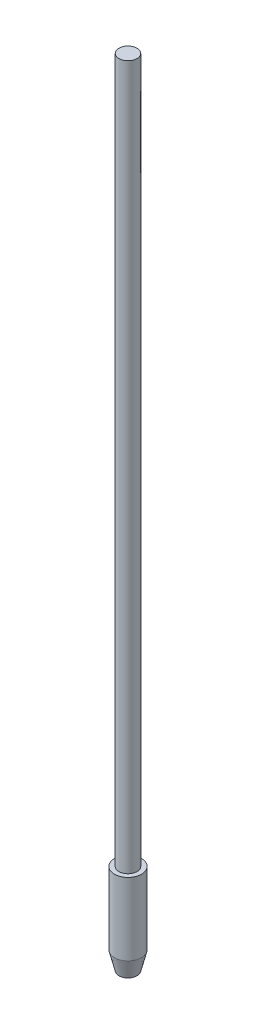
ISO-10303-21;
HEADER;
FILE_DESCRIPTION(('STEP AP214'),'2;1');
FILE_NAME('part.step','',(''),(''),'','','');
FILE_SCHEMA(('AUTOMOTIVE_DESIGN { 1 0 10303 214 1 1 1 1 }'));
ENDSEC;
DATA;
#1=APPLICATION_CONTEXT('core data for automotive mechanical design processes');
#2=APPLICATION_PROTOCOL_DEFINITION('international standard','automotive_design',2000,#1);
#3=PRODUCT_CONTEXT('',#1,'mechanical');
#4=PRODUCT('Part','Part','',(#3));
#5=PRODUCT_RELATED_PRODUCT_CATEGORY('part','',(#4));
#6=PRODUCT_DEFINITION_FORMATION('','',#4);
#7=PRODUCT_DEFINITION_CONTEXT('part definition',#1,'design');
#8=PRODUCT_DEFINITION('design','',#6,#7);
#9=PRODUCT_DEFINITION_SHAPE('','',#8);
#10=(LENGTH_UNIT() NAMED_UNIT(*) SI_UNIT(.MILLI.,.METRE.));
#11=(NAMED_UNIT(*) PLANE_ANGLE_UNIT() SI_UNIT($,.RADIAN.));
#12=(NAMED_UNIT(*) SI_UNIT($,.STERADIAN.) SOLID_ANGLE_UNIT());
#13=UNCERTAINTY_MEASURE_WITH_UNIT(LENGTH_MEASURE(1.E-05),#10,'distance_accuracy_value','');
#14=(GEOMETRIC_REPRESENTATION_CONTEXT(3) GLOBAL_UNCERTAINTY_ASSIGNED_CONTEXT((#13)) GLOBAL_UNIT_ASSIGNED_CONTEXT((#10,
#11,#12)) REPRESENTATION_CONTEXT('',''));
#15=CARTESIAN_POINT('',(0.,0.,0.));
#16=DIRECTION('',(0.,0.,1.));
#17=DIRECTION('',(1.,0.,0.));
#18=AXIS2_PLACEMENT_3D('',#15,#16,#17);
#19=CARTESIAN_POINT('',(276.355570330909,-390.,-125.849309683741));
#20=DIRECTION('',(0.,1.,0.));
#21=DIRECTION('',(0.,0.,1.));
#22=AXIS2_PLACEMENT_3D('',#19,#20,#21);
#23=CYLINDRICAL_SURFACE('',#22,4.99999999999999);
#24=CARTESIAN_POINT('',(276.355570330909,-390.,-125.849309683741));
#25=DIRECTION('',(0.,1.,0.));
#26=DIRECTION('',(0.,0.,1.));
#27=AXIS2_PLACEMENT_3D('',#24,#25,#26);
#28=CIRCLE('',#27,4.99999999999999);
#29=CARTESIAN_POINT('',(276.355570330909,-390.,-120.849309683741));
#30=VERTEX_POINT('',#29);
#31=EDGE_CURVE('E53',#30,#30,#28,.T.);
#32=ORIENTED_EDGE('',*,*,#31,.T.);
#33=EDGE_LOOP('',(#32));
#34=FACE_BOUND('',#33,.T.);
#35=CARTESIAN_POINT('',(276.355570330909,0.,-125.849309683741));
#36=DIRECTION('',(0.,1.,0.));
#37=DIRECTION('',(0.,0.,1.));
#38=AXIS2_PLACEMENT_3D('',#35,#36,#37);
#39=CIRCLE('',#38,4.99999999999999);
#40=CARTESIAN_POINT('',(276.355570330909,0.,-120.849309683741));
#41=VERTEX_POINT('',#40);
#42=EDGE_CURVE('E11',#41,#41,#39,.T.);
#43=ORIENTED_EDGE('',*,*,#42,.F.);
#44=EDGE_LOOP('',(#43));
#45=FACE_BOUND('',#44,.T.);
#46=ADVANCED_FACE('F45',(#34,#45),#23,.T.);
#47=CARTESIAN_POINT('',(276.355570330909,0.,-125.849309683741));
#48=DIRECTION('',(0.,1.,0.));
#49=DIRECTION('',(0.,0.,1.));
#50=AXIS2_PLACEMENT_3D('',#47,#48,#49);
#51=PLANE('',#50);
#52=ORIENTED_EDGE('',*,*,#42,.T.);
#53=EDGE_LOOP('',(#52));
#54=FACE_BOUND('',#53,.T.);
#55=ADVANCED_FACE('F102',(#54),#51,.T.);
#56=CARTESIAN_POINT('',(276.355570330909,-430.,-125.849309683741));
#57=DIRECTION('',(0.,1.,0.));
#58=DIRECTION('',(0.,0.,1.));
#59=AXIS2_PLACEMENT_3D('',#56,#57,#58);
#60=CYLINDRICAL_SURFACE('',#59,7.50000000000001);
#61=CARTESIAN_POINT('',(276.355570330909,-430.,-125.849309683741));
#62=DIRECTION('',(0.,1.,0.));
#63=DIRECTION('',(0.,0.,1.));
#64=AXIS2_PLACEMENT_3D('',#61,#62,#63);
#65=CIRCLE('',#64,7.50000000000001);
#66=CARTESIAN_POINT('',(276.355570330909,-430.,-118.349309683741));
#67=VERTEX_POINT('',#66);
#68=EDGE_CURVE('E59',#67,#67,#65,.F.);
#69=ORIENTED_EDGE('',*,*,#68,.F.);
#70=EDGE_LOOP('',(#69));
#71=FACE_BOUND('',#70,.T.);
#72=CARTESIAN_POINT('',(276.355570330909,-390.,-125.849309683741));
#73=DIRECTION('',(0.,-1.,0.));
#74=DIRECTION('',(0.,0.,-1.));
#75=AXIS2_PLACEMENT_3D('',#72,#73,#74);
#76=CIRCLE('',#75,7.50000000000001);
#77=CARTESIAN_POINT('',(276.355570330909,-390.,-133.349309683741));
#78=VERTEX_POINT('',#77);
#79=EDGE_CURVE('E64',#78,#78,#76,.T.);
#80=ORIENTED_EDGE('',*,*,#79,.T.);
#81=EDGE_LOOP('',(#80));
#82=FACE_BOUND('',#81,.T.);
#83=ADVANCED_FACE('F99',(#71,#82),#60,.T.);
#84=CARTESIAN_POINT('',(276.355570330909,-390.,-125.849309683741));
#85=DIRECTION('',(0.,-1.,0.));
#86=DIRECTION('',(0.,0.,-1.));
#87=AXIS2_PLACEMENT_3D('',#84,#85,#86);
#88=PLANE('',#87);
#89=ORIENTED_EDGE('',*,*,#31,.F.);
#90=EDGE_LOOP('',(#89));
#91=FACE_BOUND('',#90,.T.);
#92=ORIENTED_EDGE('',*,*,#79,.F.);
#93=EDGE_LOOP('',(#92));
#94=FACE_BOUND('',#93,.T.);
#95=ADVANCED_FACE('F94',(#91,#94),#88,.F.);
#96=CARTESIAN_POINT('',(276.355570330909,-440.,-125.849309683741));
#97=DIRECTION('',(0.,-1.,0.));
#98=DIRECTION('',(0.,0.,-1.));
#99=AXIS2_PLACEMENT_3D('',#96,#97,#98);
#100=PLANE('',#99);
#101=CARTESIAN_POINT('',(276.355570330909,-440.,-125.849309683741));
#102=DIRECTION('',(0.,-1.,0.));
#103=DIRECTION('',(0.,0.,-1.));
#104=AXIS2_PLACEMENT_3D('',#101,#102,#103);
#105=CIRCLE('',#104,5.);
#106=CARTESIAN_POINT('',(276.355570330909,-440.,-130.849309683741));
#107=VERTEX_POINT('',#106);
#108=EDGE_CURVE('E69',#107,#107,#105,.T.);
#109=ORIENTED_EDGE('',*,*,#108,.T.);
#110=EDGE_LOOP('',(#109));
#111=FACE_BOUND('',#110,.T.);
#112=ADVANCED_FACE('F83',(#111),#100,.T.);
#113=CARTESIAN_POINT('',(276.355570330909,-440.,-125.849309683741));
#114=DIRECTION('',(0.,1.,0.));
#115=DIRECTION('',(0.,0.,1.));
#116=AXIS2_PLACEMENT_3D('',#113,#114,#115);
#117=CONICAL_SURFACE('',#116,5.,0.244978663126865);
#118=ORIENTED_EDGE('',*,*,#68,.T.);
#119=EDGE_LOOP('',(#118));
#120=FACE_BOUND('',#119,.T.);
#121=ORIENTED_EDGE('',*,*,#108,.F.);
#122=EDGE_LOOP('',(#121));
#123=FACE_BOUND('',#122,.T.);
#124=ADVANCED_FACE('F93',(#120,#123),#117,.T.);
#125=CLOSED_SHELL('',(#46,#55,#83,#95,#112,#124));
#126=MANIFOLD_SOLID_BREP('B2',#125);
#127=ADVANCED_BREP_SHAPE_REPRESENTATION('',(#18,#126),#14);
#128=SHAPE_DEFINITION_REPRESENTATION(#9,#127);
ENDSEC;
END-ISO-10303-21;
